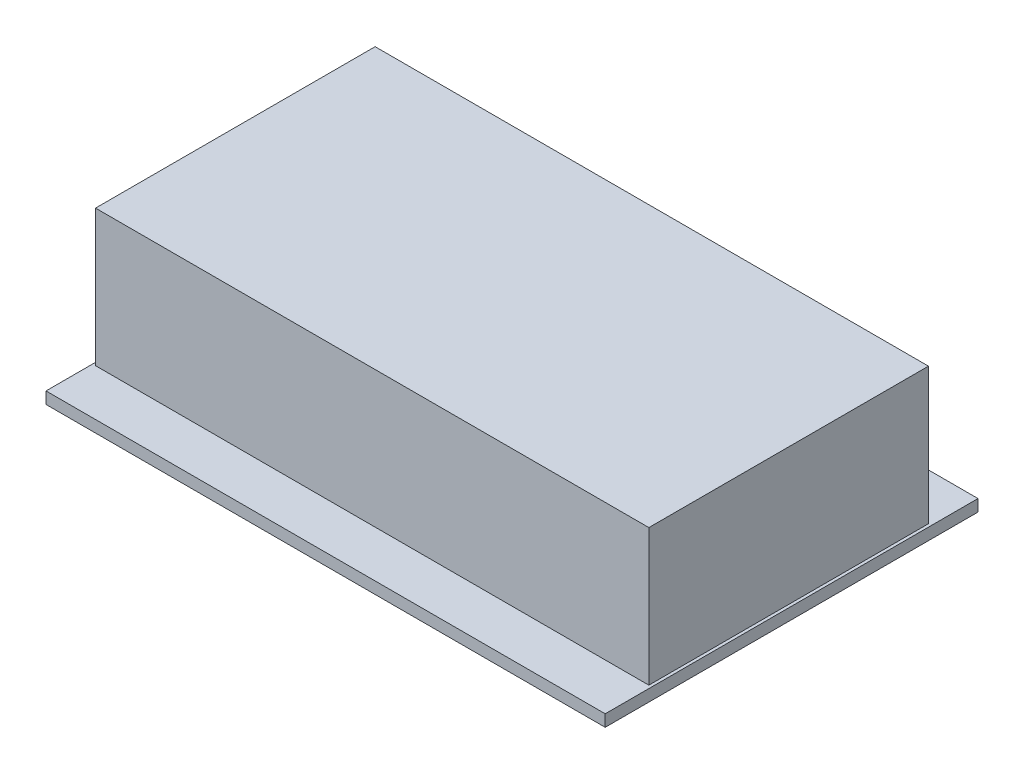
ISO-10303-21;
HEADER;
FILE_DESCRIPTION(('STEP AP214'),'2;1');
FILE_NAME('part.step','',(''),(''),'','','');
FILE_SCHEMA(('AUTOMOTIVE_DESIGN { 1 0 10303 214 1 1 1 1 }'));
ENDSEC;
DATA;
#1=APPLICATION_CONTEXT('core data for automotive mechanical design processes');
#2=APPLICATION_PROTOCOL_DEFINITION('international standard','automotive_design',2000,#1);
#3=PRODUCT_CONTEXT('',#1,'mechanical');
#4=PRODUCT('Part','Part','',(#3));
#5=PRODUCT_RELATED_PRODUCT_CATEGORY('part','',(#4));
#6=PRODUCT_DEFINITION_FORMATION('','',#4);
#7=PRODUCT_DEFINITION_CONTEXT('part definition',#1,'design');
#8=PRODUCT_DEFINITION('design','',#6,#7);
#9=PRODUCT_DEFINITION_SHAPE('','',#8);
#10=(LENGTH_UNIT() NAMED_UNIT(*) SI_UNIT(.MILLI.,.METRE.));
#11=(NAMED_UNIT(*) PLANE_ANGLE_UNIT() SI_UNIT($,.RADIAN.));
#12=(NAMED_UNIT(*) SI_UNIT($,.STERADIAN.) SOLID_ANGLE_UNIT());
#13=UNCERTAINTY_MEASURE_WITH_UNIT(LENGTH_MEASURE(1.E-05),#10,'distance_accuracy_value','');
#14=(GEOMETRIC_REPRESENTATION_CONTEXT(3) GLOBAL_UNCERTAINTY_ASSIGNED_CONTEXT((#13)) GLOBAL_UNIT_ASSIGNED_CONTEXT((#10,
#11,#12)) REPRESENTATION_CONTEXT('',''));
#15=CARTESIAN_POINT('',(0.,0.,0.));
#16=DIRECTION('',(0.,0.,1.));
#17=DIRECTION('',(1.,0.,0.));
#18=AXIS2_PLACEMENT_3D('',#15,#16,#17);
#19=CARTESIAN_POINT('',(-38.1,1.6,25.4));
#20=DIRECTION('',(0.,0.,-1.));
#21=DIRECTION('',(-1.,0.,0.));
#22=AXIS2_PLACEMENT_3D('',#19,#20,#21);
#23=PLANE('',#22);
#24=DIRECTION('',(1.,0.,0.));
#25=VECTOR('',#24,1.);
#26=CARTESIAN_POINT('',(-38.1,0.,25.4));
#27=LINE('',#26,#25);
#28=CARTESIAN_POINT('',(-38.1,0.,25.4));
#29=VERTEX_POINT('',#28);
#30=CARTESIAN_POINT('',(38.1,0.,25.4));
#31=VERTEX_POINT('',#30);
#32=EDGE_CURVE('E117',#29,#31,#27,.T.);
#33=ORIENTED_EDGE('',*,*,#32,.T.);
#34=DIRECTION('',(0.,-1.,0.));
#35=VECTOR('',#34,1.);
#36=CARTESIAN_POINT('',(38.1,1.6,25.4));
#37=LINE('',#36,#35);
#38=CARTESIAN_POINT('',(38.1,1.6,25.4));
#39=VERTEX_POINT('',#38);
#40=EDGE_CURVE('E11',#39,#31,#37,.T.);
#41=ORIENTED_EDGE('',*,*,#40,.F.);
#42=DIRECTION('',(1.,0.,0.));
#43=VECTOR('',#42,1.);
#44=CARTESIAN_POINT('',(-38.1,1.6,25.4));
#45=LINE('',#44,#43);
#46=CARTESIAN_POINT('',(-38.1,1.6,25.4));
#47=VERTEX_POINT('',#46);
#48=EDGE_CURVE('E126',#47,#39,#45,.T.);
#49=ORIENTED_EDGE('',*,*,#48,.F.);
#50=DIRECTION('',(0.,-1.,0.));
#51=VECTOR('',#50,1.);
#52=CARTESIAN_POINT('',(-38.1,1.6,25.4));
#53=LINE('',#52,#51);
#54=EDGE_CURVE('E137',#47,#29,#53,.T.);
#55=ORIENTED_EDGE('',*,*,#54,.T.);
#56=EDGE_LOOP('',(#33,#41,#49,#55));
#57=FACE_BOUND('',#56,.T.);
#58=ADVANCED_FACE('F33',(#57),#23,.F.);
#59=CARTESIAN_POINT('',(38.1,1.6,25.4));
#60=DIRECTION('',(-1.,0.,0.));
#61=DIRECTION('',(0.,0.,1.));
#62=AXIS2_PLACEMENT_3D('',#59,#60,#61);
#63=PLANE('',#62);
#64=DIRECTION('',(0.,0.,-1.));
#65=VECTOR('',#64,1.);
#66=CARTESIAN_POINT('',(38.1,0.,25.4));
#67=LINE('',#66,#65);
#68=CARTESIAN_POINT('',(38.1,0.,-25.4));
#69=VERTEX_POINT('',#68);
#70=EDGE_CURVE('E120',#31,#69,#67,.T.);
#71=ORIENTED_EDGE('',*,*,#70,.T.);
#72=DIRECTION('',(0.,-1.,0.));
#73=VECTOR('',#72,1.);
#74=CARTESIAN_POINT('',(38.1,1.6,-25.4));
#75=LINE('',#74,#73);
#76=CARTESIAN_POINT('',(38.1,1.6,-25.4));
#77=VERTEX_POINT('',#76);
#78=EDGE_CURVE('E40',#77,#69,#75,.T.);
#79=ORIENTED_EDGE('',*,*,#78,.F.);
#80=DIRECTION('',(0.,0.,-1.));
#81=VECTOR('',#80,1.);
#82=CARTESIAN_POINT('',(38.1,1.6,25.4));
#83=LINE('',#82,#81);
#84=EDGE_CURVE('E129',#39,#77,#83,.T.);
#85=ORIENTED_EDGE('',*,*,#84,.F.);
#86=ORIENTED_EDGE('',*,*,#40,.T.);
#87=EDGE_LOOP('',(#71,#79,#85,#86));
#88=FACE_BOUND('',#87,.T.);
#89=ADVANCED_FACE('F154',(#88),#63,.F.);
#90=CARTESIAN_POINT('',(-38.1,1.6,-25.4));
#91=DIRECTION('',(0.,0.,-1.));
#92=DIRECTION('',(-1.,0.,0.));
#93=AXIS2_PLACEMENT_3D('',#90,#91,#92);
#94=PLANE('',#93);
#95=DIRECTION('',(1.,0.,0.));
#96=VECTOR('',#95,1.);
#97=CARTESIAN_POINT('',(-38.1,0.,-25.4));
#98=LINE('',#97,#96);
#99=CARTESIAN_POINT('',(-38.1,0.,-25.4));
#100=VERTEX_POINT('',#99);
#101=EDGE_CURVE('E141',#100,#69,#98,.T.);
#102=ORIENTED_EDGE('',*,*,#101,.F.);
#103=DIRECTION('',(0.,-1.,0.));
#104=VECTOR('',#103,1.);
#105=CARTESIAN_POINT('',(-38.1,1.6,-25.4));
#106=LINE('',#105,#104);
#107=CARTESIAN_POINT('',(-38.1,1.6,-25.4));
#108=VERTEX_POINT('',#107);
#109=EDGE_CURVE('E147',#108,#100,#106,.T.);
#110=ORIENTED_EDGE('',*,*,#109,.F.);
#111=DIRECTION('',(1.,0.,0.));
#112=VECTOR('',#111,1.);
#113=CARTESIAN_POINT('',(-38.1,1.6,-25.4));
#114=LINE('',#113,#112);
#115=EDGE_CURVE('E132',#108,#77,#114,.T.);
#116=ORIENTED_EDGE('',*,*,#115,.T.);
#117=ORIENTED_EDGE('',*,*,#78,.T.);
#118=EDGE_LOOP('',(#102,#110,#116,#117));
#119=FACE_BOUND('',#118,.T.);
#120=ADVANCED_FACE('F151',(#119),#94,.T.);
#121=CARTESIAN_POINT('',(-38.1,1.6,25.4));
#122=DIRECTION('',(-1.,0.,0.));
#123=DIRECTION('',(0.,0.,1.));
#124=AXIS2_PLACEMENT_3D('',#121,#122,#123);
#125=PLANE('',#124);
#126=DIRECTION('',(0.,0.,-1.));
#127=VECTOR('',#126,1.);
#128=CARTESIAN_POINT('',(-38.1,0.,25.4));
#129=LINE('',#128,#127);
#130=EDGE_CURVE('E130',#29,#100,#129,.T.);
#131=ORIENTED_EDGE('',*,*,#130,.F.);
#132=ORIENTED_EDGE('',*,*,#54,.F.);
#133=DIRECTION('',(0.,0.,-1.));
#134=VECTOR('',#133,1.);
#135=CARTESIAN_POINT('',(-38.1,1.6,25.4));
#136=LINE('',#135,#134);
#137=EDGE_CURVE('E135',#47,#108,#136,.T.);
#138=ORIENTED_EDGE('',*,*,#137,.T.);
#139=ORIENTED_EDGE('',*,*,#109,.T.);
#140=EDGE_LOOP('',(#131,#132,#138,#139));
#141=FACE_BOUND('',#140,.T.);
#142=ADVANCED_FACE('F161',(#141),#125,.T.);
#143=CARTESIAN_POINT('',(0.,1.6,0.));
#144=DIRECTION('',(0.,1.,0.));
#145=DIRECTION('',(0.,0.,1.));
#146=AXIS2_PLACEMENT_3D('',#143,#144,#145);
#147=PLANE('',#146);
#148=DIRECTION('',(1.,0.,0.));
#149=VECTOR('',#148,1.);
#150=CARTESIAN_POINT('',(-37.7,1.6,19.05));
#151=LINE('',#150,#149);
#152=CARTESIAN_POINT('',(-37.7,1.6,19.05));
#153=VERTEX_POINT('',#152);
#154=CARTESIAN_POINT('',(37.7,1.6,19.05));
#155=VERTEX_POINT('',#154);
#156=EDGE_CURVE('E47',#153,#155,#151,.T.);
#157=ORIENTED_EDGE('',*,*,#156,.F.);
#158=DIRECTION('',(0.,0.,1.));
#159=VECTOR('',#158,1.);
#160=CARTESIAN_POINT('',(-37.7,1.6,19.05));
#161=LINE('',#160,#159);
#162=CARTESIAN_POINT('',(-37.7,1.6,-19.05));
#163=VERTEX_POINT('',#162);
#164=EDGE_CURVE('E51',#163,#153,#161,.T.);
#165=ORIENTED_EDGE('',*,*,#164,.F.);
#166=DIRECTION('',(-1.,0.,0.));
#167=VECTOR('',#166,1.);
#168=CARTESIAN_POINT('',(-37.7,1.6,-19.05));
#169=LINE('',#168,#167);
#170=CARTESIAN_POINT('',(37.7,1.6,-19.05));
#171=VERTEX_POINT('',#170);
#172=EDGE_CURVE('E260',#171,#163,#169,.T.);
#173=ORIENTED_EDGE('',*,*,#172,.F.);
#174=DIRECTION('',(0.,0.,-1.));
#175=VECTOR('',#174,1.);
#176=CARTESIAN_POINT('',(37.7,1.6,19.05));
#177=LINE('',#176,#175);
#178=EDGE_CURVE('E266',#155,#171,#177,.T.);
#179=ORIENTED_EDGE('',*,*,#178,.F.);
#180=EDGE_LOOP('',(#157,#165,#173,#179));
#181=FACE_BOUND('',#180,.T.);
#182=ORIENTED_EDGE('',*,*,#48,.T.);
#183=ORIENTED_EDGE('',*,*,#84,.T.);
#184=ORIENTED_EDGE('',*,*,#115,.F.);
#185=ORIENTED_EDGE('',*,*,#137,.F.);
#186=EDGE_LOOP('',(#182,#183,#184,#185));
#187=FACE_BOUND('',#186,.T.);
#188=ADVANCED_FACE('F165',(#181,#187),#147,.T.);
#189=CARTESIAN_POINT('',(0.,0.,0.));
#190=DIRECTION('',(0.,1.,0.));
#191=DIRECTION('',(0.,0.,1.));
#192=AXIS2_PLACEMENT_3D('',#189,#190,#191);
#193=PLANE('',#192);
#194=ORIENTED_EDGE('',*,*,#32,.F.);
#195=ORIENTED_EDGE('',*,*,#130,.T.);
#196=ORIENTED_EDGE('',*,*,#101,.T.);
#197=ORIENTED_EDGE('',*,*,#70,.F.);
#198=EDGE_LOOP('',(#194,#195,#196,#197));
#199=FACE_BOUND('',#198,.T.);
#200=ADVANCED_FACE('F158',(#199),#193,.F.);
#201=CARTESIAN_POINT('',(-37.7,20.2,19.05));
#202=DIRECTION('',(0.,0.,-1.));
#203=DIRECTION('',(-1.,0.,0.));
#204=AXIS2_PLACEMENT_3D('',#201,#202,#203);
#205=PLANE('',#204);
#206=ORIENTED_EDGE('',*,*,#156,.T.);
#207=DIRECTION('',(0.,-1.,0.));
#208=VECTOR('',#207,1.);
#209=CARTESIAN_POINT('',(37.7,20.2,19.05));
#210=LINE('',#209,#208);
#211=CARTESIAN_POINT('',(37.7,20.2,19.05));
#212=VERTEX_POINT('',#211);
#213=EDGE_CURVE('E100',#212,#155,#210,.T.);
#214=ORIENTED_EDGE('',*,*,#213,.F.);
#215=DIRECTION('',(1.,0.,0.));
#216=VECTOR('',#215,1.);
#217=CARTESIAN_POINT('',(-37.7,20.2,19.05));
#218=LINE('',#217,#216);
#219=CARTESIAN_POINT('',(-37.7,20.2,19.05));
#220=VERTEX_POINT('',#219);
#221=EDGE_CURVE('E106',#220,#212,#218,.T.);
#222=ORIENTED_EDGE('',*,*,#221,.F.);
#223=DIRECTION('',(0.,-1.,0.));
#224=VECTOR('',#223,1.);
#225=CARTESIAN_POINT('',(-37.7,20.2,19.05));
#226=LINE('',#225,#224);
#227=EDGE_CURVE('E258',#220,#153,#226,.T.);
#228=ORIENTED_EDGE('',*,*,#227,.T.);
#229=EDGE_LOOP('',(#206,#214,#222,#228));
#230=FACE_BOUND('',#229,.T.);
#231=ADVANCED_FACE('F116',(#230),#205,.F.);
#232=CARTESIAN_POINT('',(37.7,20.2,19.05));
#233=DIRECTION('',(-1.,0.,0.));
#234=DIRECTION('',(0.,0.,1.));
#235=AXIS2_PLACEMENT_3D('',#232,#233,#234);
#236=PLANE('',#235);
#237=ORIENTED_EDGE('',*,*,#178,.T.);
#238=DIRECTION('',(0.,-1.,0.));
#239=VECTOR('',#238,1.);
#240=CARTESIAN_POINT('',(37.7,20.2,-19.05));
#241=LINE('',#240,#239);
#242=CARTESIAN_POINT('',(37.7,20.2,-19.05));
#243=VERTEX_POINT('',#242);
#244=EDGE_CURVE('E102',#243,#171,#241,.T.);
#245=ORIENTED_EDGE('',*,*,#244,.F.);
#246=DIRECTION('',(0.,0.,-1.));
#247=VECTOR('',#246,1.);
#248=CARTESIAN_POINT('',(37.7,20.2,19.05));
#249=LINE('',#248,#247);
#250=EDGE_CURVE('E95',#212,#243,#249,.T.);
#251=ORIENTED_EDGE('',*,*,#250,.F.);
#252=ORIENTED_EDGE('',*,*,#213,.T.);
#253=EDGE_LOOP('',(#237,#245,#251,#252));
#254=FACE_BOUND('',#253,.T.);
#255=ADVANCED_FACE('F98',(#254),#236,.F.);
#256=CARTESIAN_POINT('',(-37.7,20.2,-19.05));
#257=DIRECTION('',(0.,0.,1.));
#258=DIRECTION('',(1.,0.,0.));
#259=AXIS2_PLACEMENT_3D('',#256,#257,#258);
#260=PLANE('',#259);
#261=ORIENTED_EDGE('',*,*,#172,.T.);
#262=DIRECTION('',(0.,-1.,0.));
#263=VECTOR('',#262,1.);
#264=CARTESIAN_POINT('',(-37.7,20.2,-19.05));
#265=LINE('',#264,#263);
#266=CARTESIAN_POINT('',(-37.7,20.2,-19.05));
#267=VERTEX_POINT('',#266);
#268=EDGE_CURVE('E122',#267,#163,#265,.T.);
#269=ORIENTED_EDGE('',*,*,#268,.F.);
#270=DIRECTION('',(-1.,0.,0.));
#271=VECTOR('',#270,1.);
#272=CARTESIAN_POINT('',(-37.7,20.2,-19.05));
#273=LINE('',#272,#271);
#274=EDGE_CURVE('E105',#243,#267,#273,.T.);
#275=ORIENTED_EDGE('',*,*,#274,.F.);
#276=ORIENTED_EDGE('',*,*,#244,.T.);
#277=EDGE_LOOP('',(#261,#269,#275,#276));
#278=FACE_BOUND('',#277,.T.);
#279=ADVANCED_FACE('F186',(#278),#260,.F.);
#280=CARTESIAN_POINT('',(-37.7,20.2,19.05));
#281=DIRECTION('',(1.,0.,0.));
#282=DIRECTION('',(0.,0.,-1.));
#283=AXIS2_PLACEMENT_3D('',#280,#281,#282);
#284=PLANE('',#283);
#285=ORIENTED_EDGE('',*,*,#164,.T.);
#286=ORIENTED_EDGE('',*,*,#227,.F.);
#287=DIRECTION('',(0.,0.,1.));
#288=VECTOR('',#287,1.);
#289=CARTESIAN_POINT('',(-37.7,20.2,19.05));
#290=LINE('',#289,#288);
#291=EDGE_CURVE('E111',#267,#220,#290,.T.);
#292=ORIENTED_EDGE('',*,*,#291,.F.);
#293=ORIENTED_EDGE('',*,*,#268,.T.);
#294=EDGE_LOOP('',(#285,#286,#292,#293));
#295=FACE_BOUND('',#294,.T.);
#296=ADVANCED_FACE('F189',(#295),#284,.F.);
#297=CARTESIAN_POINT('',(0.,20.2,0.));
#298=DIRECTION('',(0.,1.,0.));
#299=DIRECTION('',(0.,0.,1.));
#300=AXIS2_PLACEMENT_3D('',#297,#298,#299);
#301=PLANE('',#300);
#302=ORIENTED_EDGE('',*,*,#221,.T.);
#303=ORIENTED_EDGE('',*,*,#250,.T.);
#304=ORIENTED_EDGE('',*,*,#274,.T.);
#305=ORIENTED_EDGE('',*,*,#291,.T.);
#306=EDGE_LOOP('',(#302,#303,#304,#305));
#307=FACE_BOUND('',#306,.T.);
#308=ADVANCED_FACE('F109',(#307),#301,.T.);
#309=CLOSED_SHELL('',(#58,#89,#120,#142,#188,#200,#231,#255,#279,#296,#308));
#310=MANIFOLD_SOLID_BREP('B2',#309);
#311=ADVANCED_BREP_SHAPE_REPRESENTATION('',(#18,#310),#14);
#312=SHAPE_DEFINITION_REPRESENTATION(#9,#311);
ENDSEC;
END-ISO-10303-21;
